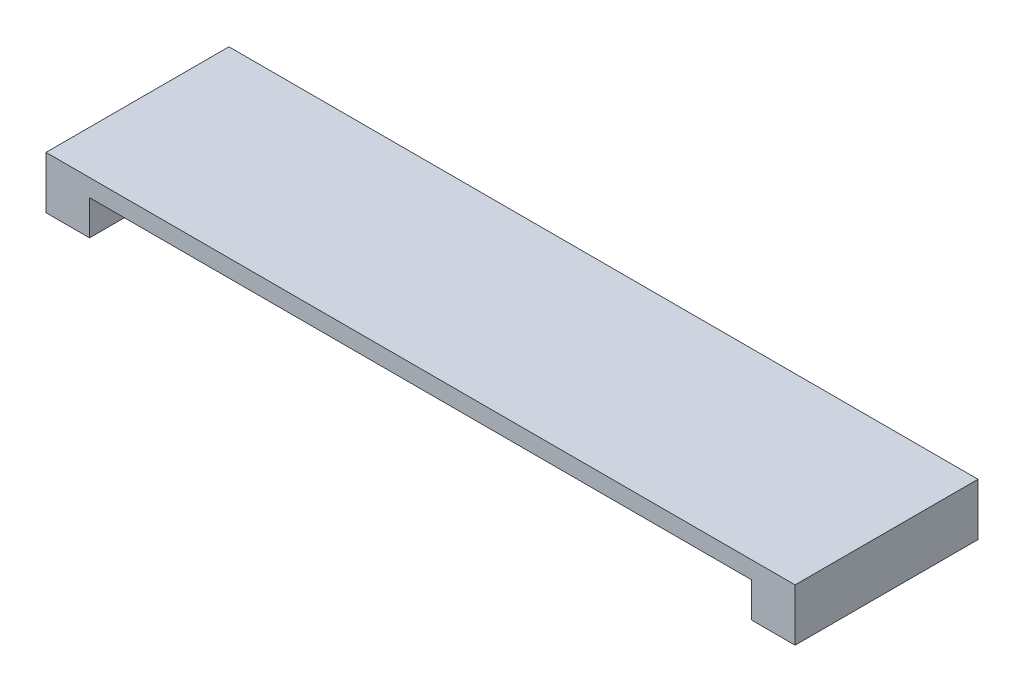
ISO-10303-21;
HEADER;
FILE_DESCRIPTION(('STEP AP214'),'2;1');
FILE_NAME('part.step','',(''),(''),'','','');
FILE_SCHEMA(('AUTOMOTIVE_DESIGN { 1 0 10303 214 1 1 1 1 }'));
ENDSEC;
DATA;
#1=APPLICATION_CONTEXT('core data for automotive mechanical design processes');
#2=APPLICATION_PROTOCOL_DEFINITION('international standard','automotive_design',2000,#1);
#3=PRODUCT_CONTEXT('',#1,'mechanical');
#4=PRODUCT('Part','Part','',(#3));
#5=PRODUCT_RELATED_PRODUCT_CATEGORY('part','',(#4));
#6=PRODUCT_DEFINITION_FORMATION('','',#4);
#7=PRODUCT_DEFINITION_CONTEXT('part definition',#1,'design');
#8=PRODUCT_DEFINITION('design','',#6,#7);
#9=PRODUCT_DEFINITION_SHAPE('','',#8);
#10=(LENGTH_UNIT() NAMED_UNIT(*) SI_UNIT(.MILLI.,.METRE.));
#11=(NAMED_UNIT(*) PLANE_ANGLE_UNIT() SI_UNIT($,.RADIAN.));
#12=(NAMED_UNIT(*) SI_UNIT($,.STERADIAN.) SOLID_ANGLE_UNIT());
#13=UNCERTAINTY_MEASURE_WITH_UNIT(LENGTH_MEASURE(1.E-05),#10,'distance_accuracy_value','');
#14=(GEOMETRIC_REPRESENTATION_CONTEXT(3) GLOBAL_UNCERTAINTY_ASSIGNED_CONTEXT((#13)) GLOBAL_UNIT_ASSIGNED_CONTEXT((#10,
#11,#12)) REPRESENTATION_CONTEXT('',''));
#15=CARTESIAN_POINT('',(0.,0.,0.));
#16=DIRECTION('',(0.,0.,1.));
#17=DIRECTION('',(1.,0.,0.));
#18=AXIS2_PLACEMENT_3D('',#15,#16,#17);
#19=CARTESIAN_POINT('',(0.,0.,0.));
#20=DIRECTION('',(0.,-1.,0.));
#21=DIRECTION('',(0.,0.,-1.));
#22=AXIS2_PLACEMENT_3D('',#19,#20,#21);
#23=PLANE('',#22);
#24=DIRECTION('',(-1.,0.,0.));
#25=VECTOR('',#24,1.);
#26=CARTESIAN_POINT('',(-430.,0.,-105.));
#27=LINE('',#26,#25);
#28=CARTESIAN_POINT('',(380.,0.,-105.));
#29=VERTEX_POINT('',#28);
#30=CARTESIAN_POINT('',(-380.,0.,-105.));
#31=VERTEX_POINT('',#30);
#32=EDGE_CURVE('E61',#29,#31,#27,.T.);
#33=ORIENTED_EDGE('',*,*,#32,.F.);
#34=DIRECTION('',(0.,0.,-1.));
#35=VECTOR('',#34,1.);
#36=CARTESIAN_POINT('',(380.,0.,169.031242374328));
#37=LINE('',#36,#35);
#38=CARTESIAN_POINT('',(380.,0.,105.));
#39=VERTEX_POINT('',#38);
#40=EDGE_CURVE('E116',#39,#29,#37,.T.);
#41=ORIENTED_EDGE('',*,*,#40,.F.);
#42=DIRECTION('',(1.,0.,0.));
#43=VECTOR('',#42,1.);
#44=CARTESIAN_POINT('',(-430.,0.,105.));
#45=LINE('',#44,#43);
#46=CARTESIAN_POINT('',(-380.,0.,105.));
#47=VERTEX_POINT('',#46);
#48=EDGE_CURVE('E128',#47,#39,#45,.T.);
#49=ORIENTED_EDGE('',*,*,#48,.F.);
#50=DIRECTION('',(0.,0.,-1.));
#51=VECTOR('',#50,1.);
#52=CARTESIAN_POINT('',(-380.,0.,169.031242374328));
#53=LINE('',#52,#51);
#54=EDGE_CURVE('E174',#47,#31,#53,.T.);
#55=ORIENTED_EDGE('',*,*,#54,.T.);
#56=EDGE_LOOP('',(#33,#41,#49,#55));
#57=FACE_BOUND('',#56,.T.);
#58=ADVANCED_FACE('F45',(#57),#23,.T.);
#59=CARTESIAN_POINT('',(430.,20.,105.));
#60=DIRECTION('',(-1.,0.,0.));
#61=DIRECTION('',(0.,0.,1.));
#62=AXIS2_PLACEMENT_3D('',#59,#60,#61);
#63=PLANE('',#62);
#64=DIRECTION('',(0.,-1.,0.));
#65=VECTOR('',#64,1.);
#66=CARTESIAN_POINT('',(430.,20.,105.));
#67=LINE('',#66,#65);
#68=CARTESIAN_POINT('',(430.,20.,105.));
#69=VERTEX_POINT('',#68);
#70=CARTESIAN_POINT('',(430.,-40.,105.));
#71=VERTEX_POINT('',#70);
#72=EDGE_CURVE('E146',#69,#71,#67,.T.);
#73=ORIENTED_EDGE('',*,*,#72,.T.);
#74=DIRECTION('',(0.,0.,-1.));
#75=VECTOR('',#74,1.);
#76=CARTESIAN_POINT('',(430.,-40.,169.031242374328));
#77=LINE('',#76,#75);
#78=CARTESIAN_POINT('',(430.,-40.,-105.));
#79=VERTEX_POINT('',#78);
#80=EDGE_CURVE('E199',#71,#79,#77,.T.);
#81=ORIENTED_EDGE('',*,*,#80,.T.);
#82=DIRECTION('',(0.,-1.,0.));
#83=VECTOR('',#82,1.);
#84=CARTESIAN_POINT('',(430.,20.,-105.));
#85=LINE('',#84,#83);
#86=CARTESIAN_POINT('',(430.,20.,-105.));
#87=VERTEX_POINT('',#86);
#88=EDGE_CURVE('E11',#87,#79,#85,.T.);
#89=ORIENTED_EDGE('',*,*,#88,.F.);
#90=DIRECTION('',(0.,0.,-1.));
#91=VECTOR('',#90,1.);
#92=CARTESIAN_POINT('',(430.,20.,105.));
#93=LINE('',#92,#91);
#94=EDGE_CURVE('E136',#69,#87,#93,.T.);
#95=ORIENTED_EDGE('',*,*,#94,.F.);
#96=EDGE_LOOP('',(#73,#81,#89,#95));
#97=FACE_BOUND('',#96,.T.);
#98=ADVANCED_FACE('F47',(#97),#63,.F.);
#99=CARTESIAN_POINT('',(-430.,20.,-105.));
#100=DIRECTION('',(0.,0.,1.));
#101=DIRECTION('',(1.,0.,0.));
#102=AXIS2_PLACEMENT_3D('',#99,#100,#101);
#103=PLANE('',#102);
#104=ORIENTED_EDGE('',*,*,#88,.T.);
#105=DIRECTION('',(-1.,0.,0.));
#106=VECTOR('',#105,1.);
#107=CARTESIAN_POINT('',(430.,-40.,-105.));
#108=LINE('',#107,#106);
#109=CARTESIAN_POINT('',(380.,-40.,-105.));
#110=VERTEX_POINT('',#109);
#111=EDGE_CURVE('E202',#79,#110,#108,.T.);
#112=ORIENTED_EDGE('',*,*,#111,.T.);
#113=DIRECTION('',(0.,1.,0.));
#114=VECTOR('',#113,1.);
#115=CARTESIAN_POINT('',(380.,0.,-105.));
#116=LINE('',#115,#114);
#117=EDGE_CURVE('E179',#110,#29,#116,.T.);
#118=ORIENTED_EDGE('',*,*,#117,.T.);
#119=ORIENTED_EDGE('',*,*,#32,.T.);
#120=DIRECTION('',(0.,-1.,0.));
#121=VECTOR('',#120,1.);
#122=CARTESIAN_POINT('',(-380.,0.,-105.));
#123=LINE('',#122,#121);
#124=CARTESIAN_POINT('',(-380.,-40.,-105.));
#125=VERTEX_POINT('',#124);
#126=EDGE_CURVE('E172',#31,#125,#123,.T.);
#127=ORIENTED_EDGE('',*,*,#126,.T.);
#128=DIRECTION('',(-1.,0.,0.));
#129=VECTOR('',#128,1.);
#130=CARTESIAN_POINT('',(-430.,-40.,-105.));
#131=LINE('',#130,#129);
#132=CARTESIAN_POINT('',(-430.,-40.,-105.));
#133=VERTEX_POINT('',#132);
#134=EDGE_CURVE('E167',#125,#133,#131,.T.);
#135=ORIENTED_EDGE('',*,*,#134,.T.);
#136=DIRECTION('',(0.,-1.,0.));
#137=VECTOR('',#136,1.);
#138=CARTESIAN_POINT('',(-430.,20.,-105.));
#139=LINE('',#138,#137);
#140=CARTESIAN_POINT('',(-430.,20.,-105.));
#141=VERTEX_POINT('',#140);
#142=EDGE_CURVE('E54',#141,#133,#139,.T.);
#143=ORIENTED_EDGE('',*,*,#142,.F.);
#144=DIRECTION('',(-1.,0.,0.));
#145=VECTOR('',#144,1.);
#146=CARTESIAN_POINT('',(-430.,20.,-105.));
#147=LINE('',#146,#145);
#148=EDGE_CURVE('E140',#87,#141,#147,.T.);
#149=ORIENTED_EDGE('',*,*,#148,.F.);
#150=EDGE_LOOP('',(#104,#112,#118,#119,#127,#135,#143,#149));
#151=FACE_BOUND('',#150,.T.);
#152=ADVANCED_FACE('F171',(#151),#103,.F.);
#153=CARTESIAN_POINT('',(-430.,20.,105.));
#154=DIRECTION('',(1.,0.,0.));
#155=DIRECTION('',(0.,0.,-1.));
#156=AXIS2_PLACEMENT_3D('',#153,#154,#155);
#157=PLANE('',#156);
#158=ORIENTED_EDGE('',*,*,#142,.T.);
#159=DIRECTION('',(0.,0.,-1.));
#160=VECTOR('',#159,1.);
#161=CARTESIAN_POINT('',(-430.,-40.,169.031242374328));
#162=LINE('',#161,#160);
#163=CARTESIAN_POINT('',(-430.,-40.,105.));
#164=VERTEX_POINT('',#163);
#165=EDGE_CURVE('E159',#164,#133,#162,.T.);
#166=ORIENTED_EDGE('',*,*,#165,.F.);
#167=DIRECTION('',(0.,-1.,0.));
#168=VECTOR('',#167,1.);
#169=CARTESIAN_POINT('',(-430.,20.,105.));
#170=LINE('',#169,#168);
#171=CARTESIAN_POINT('',(-430.,20.,105.));
#172=VERTEX_POINT('',#171);
#173=EDGE_CURVE('E149',#172,#164,#170,.T.);
#174=ORIENTED_EDGE('',*,*,#173,.F.);
#175=DIRECTION('',(0.,0.,1.));
#176=VECTOR('',#175,1.);
#177=CARTESIAN_POINT('',(-430.,20.,105.));
#178=LINE('',#177,#176);
#179=EDGE_CURVE('E161',#141,#172,#178,.T.);
#180=ORIENTED_EDGE('',*,*,#179,.F.);
#181=EDGE_LOOP('',(#158,#166,#174,#180));
#182=FACE_BOUND('',#181,.T.);
#183=ADVANCED_FACE('F157',(#182),#157,.F.);
#184=CARTESIAN_POINT('',(-430.,20.,105.));
#185=DIRECTION('',(0.,0.,-1.));
#186=DIRECTION('',(-1.,0.,0.));
#187=AXIS2_PLACEMENT_3D('',#184,#185,#186);
#188=PLANE('',#187);
#189=ORIENTED_EDGE('',*,*,#173,.T.);
#190=DIRECTION('',(-1.,0.,0.));
#191=VECTOR('',#190,1.);
#192=CARTESIAN_POINT('',(-430.,-40.,105.));
#193=LINE('',#192,#191);
#194=CARTESIAN_POINT('',(-380.,-40.,105.));
#195=VERTEX_POINT('',#194);
#196=EDGE_CURVE('E142',#195,#164,#193,.T.);
#197=ORIENTED_EDGE('',*,*,#196,.F.);
#198=DIRECTION('',(0.,-1.,0.));
#199=VECTOR('',#198,1.);
#200=CARTESIAN_POINT('',(-380.,0.,105.));
#201=LINE('',#200,#199);
#202=EDGE_CURVE('E133',#47,#195,#201,.T.);
#203=ORIENTED_EDGE('',*,*,#202,.F.);
#204=ORIENTED_EDGE('',*,*,#48,.T.);
#205=DIRECTION('',(0.,1.,0.));
#206=VECTOR('',#205,1.);
#207=CARTESIAN_POINT('',(380.,0.,105.));
#208=LINE('',#207,#206);
#209=CARTESIAN_POINT('',(380.,-40.,105.));
#210=VERTEX_POINT('',#209);
#211=EDGE_CURVE('E112',#210,#39,#208,.T.);
#212=ORIENTED_EDGE('',*,*,#211,.F.);
#213=DIRECTION('',(-1.,0.,0.));
#214=VECTOR('',#213,1.);
#215=CARTESIAN_POINT('',(430.,-40.,105.));
#216=LINE('',#215,#214);
#217=EDGE_CURVE('E123',#71,#210,#216,.T.);
#218=ORIENTED_EDGE('',*,*,#217,.F.);
#219=ORIENTED_EDGE('',*,*,#72,.F.);
#220=DIRECTION('',(1.,0.,0.));
#221=VECTOR('',#220,1.);
#222=CARTESIAN_POINT('',(-430.,20.,105.));
#223=LINE('',#222,#221);
#224=EDGE_CURVE('E69',#172,#69,#223,.T.);
#225=ORIENTED_EDGE('',*,*,#224,.F.);
#226=EDGE_LOOP('',(#189,#197,#203,#204,#212,#218,#219,#225));
#227=FACE_BOUND('',#226,.T.);
#228=ADVANCED_FACE('F131',(#227),#188,.F.);
#229=CARTESIAN_POINT('',(0.,20.,0.));
#230=DIRECTION('',(0.,-1.,0.));
#231=DIRECTION('',(0.,0.,-1.));
#232=AXIS2_PLACEMENT_3D('',#229,#230,#231);
#233=PLANE('',#232);
#234=ORIENTED_EDGE('',*,*,#94,.T.);
#235=ORIENTED_EDGE('',*,*,#148,.T.);
#236=ORIENTED_EDGE('',*,*,#179,.T.);
#237=ORIENTED_EDGE('',*,*,#224,.T.);
#238=EDGE_LOOP('',(#234,#235,#236,#237));
#239=FACE_BOUND('',#238,.T.);
#240=ADVANCED_FACE('F193',(#239),#233,.F.);
#241=CARTESIAN_POINT('',(-380.,0.,169.031242374328));
#242=DIRECTION('',(-1.,0.,0.));
#243=DIRECTION('',(0.,0.,1.));
#244=AXIS2_PLACEMENT_3D('',#241,#242,#243);
#245=PLANE('',#244);
#246=ORIENTED_EDGE('',*,*,#54,.F.);
#247=ORIENTED_EDGE('',*,*,#202,.T.);
#248=DIRECTION('',(0.,0.,-1.));
#249=VECTOR('',#248,1.);
#250=CARTESIAN_POINT('',(-380.,-40.,169.031242374328));
#251=LINE('',#250,#249);
#252=EDGE_CURVE('E169',#195,#125,#251,.T.);
#253=ORIENTED_EDGE('',*,*,#252,.T.);
#254=ORIENTED_EDGE('',*,*,#126,.F.);
#255=EDGE_LOOP('',(#246,#247,#253,#254));
#256=FACE_BOUND('',#255,.T.);
#257=ADVANCED_FACE('F221',(#256),#245,.F.);
#258=CARTESIAN_POINT('',(-430.,-40.,169.031242374328));
#259=DIRECTION('',(0.,1.,0.));
#260=DIRECTION('',(0.,0.,1.));
#261=AXIS2_PLACEMENT_3D('',#258,#259,#260);
#262=PLANE('',#261);
#263=ORIENTED_EDGE('',*,*,#252,.F.);
#264=ORIENTED_EDGE('',*,*,#196,.T.);
#265=ORIENTED_EDGE('',*,*,#165,.T.);
#266=ORIENTED_EDGE('',*,*,#134,.F.);
#267=EDGE_LOOP('',(#263,#264,#265,#266));
#268=FACE_BOUND('',#267,.T.);
#269=ADVANCED_FACE('F166',(#268),#262,.F.);
#270=CARTESIAN_POINT('',(430.,-40.,169.031242374328));
#271=DIRECTION('',(0.,1.,0.));
#272=DIRECTION('',(0.,0.,1.));
#273=AXIS2_PLACEMENT_3D('',#270,#271,#272);
#274=PLANE('',#273);
#275=ORIENTED_EDGE('',*,*,#80,.F.);
#276=ORIENTED_EDGE('',*,*,#217,.T.);
#277=DIRECTION('',(0.,0.,-1.));
#278=VECTOR('',#277,1.);
#279=CARTESIAN_POINT('',(380.,-40.,169.031242374328));
#280=LINE('',#279,#278);
#281=EDGE_CURVE('E117',#210,#110,#280,.T.);
#282=ORIENTED_EDGE('',*,*,#281,.T.);
#283=ORIENTED_EDGE('',*,*,#111,.F.);
#284=EDGE_LOOP('',(#275,#276,#282,#283));
#285=FACE_BOUND('',#284,.T.);
#286=ADVANCED_FACE('F213',(#285),#274,.F.);
#287=CARTESIAN_POINT('',(380.,0.,169.031242374328));
#288=DIRECTION('',(1.,0.,0.));
#289=DIRECTION('',(0.,0.,-1.));
#290=AXIS2_PLACEMENT_3D('',#287,#288,#289);
#291=PLANE('',#290);
#292=ORIENTED_EDGE('',*,*,#281,.F.);
#293=ORIENTED_EDGE('',*,*,#211,.T.);
#294=ORIENTED_EDGE('',*,*,#40,.T.);
#295=ORIENTED_EDGE('',*,*,#117,.F.);
#296=EDGE_LOOP('',(#292,#293,#294,#295));
#297=FACE_BOUND('',#296,.T.);
#298=ADVANCED_FACE('F114',(#297),#291,.F.);
#299=CLOSED_SHELL('',(#58,#98,#152,#183,#228,#240,#257,#269,#286,#298));
#300=MANIFOLD_SOLID_BREP('B2',#299);
#301=ADVANCED_BREP_SHAPE_REPRESENTATION('',(#18,#300),#14);
#302=SHAPE_DEFINITION_REPRESENTATION(#9,#301);
ENDSEC;
END-ISO-10303-21;
